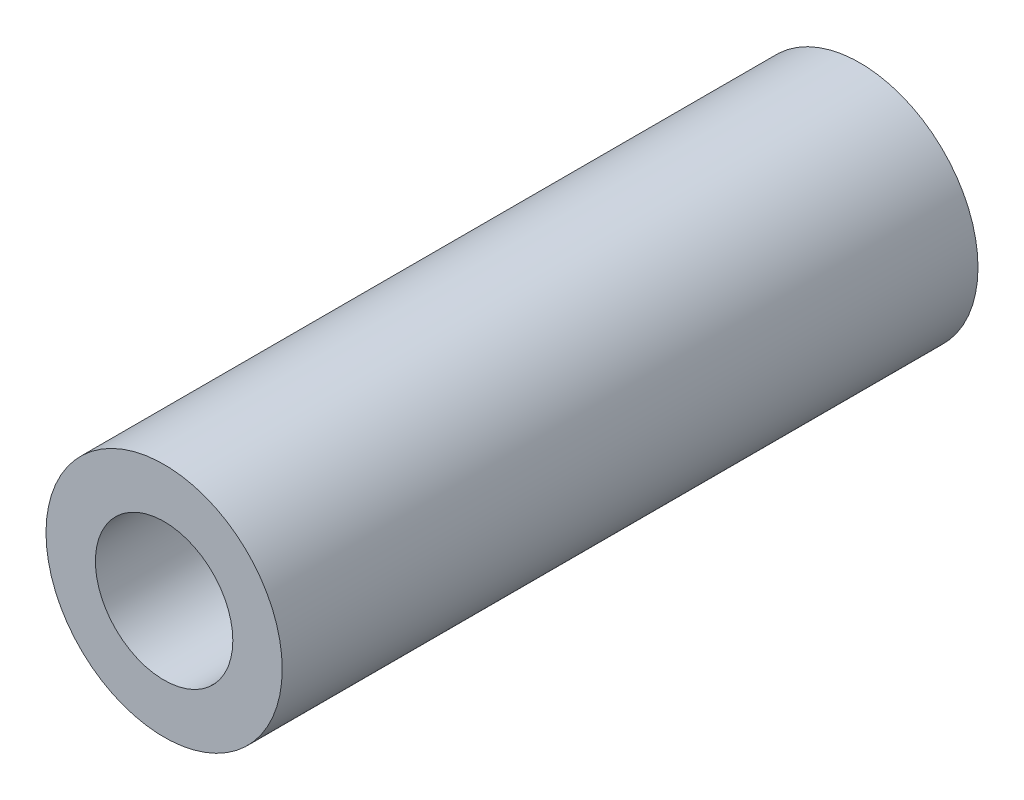
ISO-10303-21;
HEADER;
FILE_DESCRIPTION(('STEP AP214'),'2;1');
FILE_NAME('part.step','',(''),(''),'','','');
FILE_SCHEMA(('AUTOMOTIVE_DESIGN { 1 0 10303 214 1 1 1 1 }'));
ENDSEC;
DATA;
#1=APPLICATION_CONTEXT('core data for automotive mechanical design processes');
#2=APPLICATION_PROTOCOL_DEFINITION('international standard','automotive_design',2000,#1);
#3=PRODUCT_CONTEXT('',#1,'mechanical');
#4=PRODUCT('Part','Part','',(#3));
#5=PRODUCT_RELATED_PRODUCT_CATEGORY('part','',(#4));
#6=PRODUCT_DEFINITION_FORMATION('','',#4);
#7=PRODUCT_DEFINITION_CONTEXT('part definition',#1,'design');
#8=PRODUCT_DEFINITION('design','',#6,#7);
#9=PRODUCT_DEFINITION_SHAPE('','',#8);
#10=(LENGTH_UNIT() NAMED_UNIT(*) SI_UNIT(.MILLI.,.METRE.));
#11=(NAMED_UNIT(*) PLANE_ANGLE_UNIT() SI_UNIT($,.RADIAN.));
#12=(NAMED_UNIT(*) SI_UNIT($,.STERADIAN.) SOLID_ANGLE_UNIT());
#13=UNCERTAINTY_MEASURE_WITH_UNIT(LENGTH_MEASURE(1.E-05),#10,'distance_accuracy_value','');
#14=(GEOMETRIC_REPRESENTATION_CONTEXT(3) GLOBAL_UNCERTAINTY_ASSIGNED_CONTEXT((#13)) GLOBAL_UNIT_ASSIGNED_CONTEXT((#10,
#11,#12)) REPRESENTATION_CONTEXT('',''));
#15=CARTESIAN_POINT('',(0.,0.,0.));
#16=DIRECTION('',(0.,0.,1.));
#17=DIRECTION('',(1.,0.,0.));
#18=AXIS2_PLACEMENT_3D('',#15,#16,#17);
#19=CARTESIAN_POINT('',(0.,0.,16.2));
#20=DIRECTION('',(0.,0.,1.));
#21=DIRECTION('',(1.,0.,0.));
#22=AXIS2_PLACEMENT_3D('',#19,#20,#21);
#23=PLANE('',#22);
#24=CARTESIAN_POINT('',(0.,0.,16.2));
#25=DIRECTION('',(0.,0.,1.));
#26=DIRECTION('',(1.,0.,0.));
#27=AXIS2_PLACEMENT_3D('',#24,#25,#26);
#28=CIRCLE('',#27,2.75);
#29=CARTESIAN_POINT('',(2.75,0.,16.2));
#30=VERTEX_POINT('',#29);
#31=EDGE_CURVE('E10',#30,#30,#28,.T.);
#32=ORIENTED_EDGE('',*,*,#31,.T.);
#33=EDGE_LOOP('',(#32));
#34=FACE_BOUND('',#33,.T.);
#35=CARTESIAN_POINT('',(0.,0.,16.2));
#36=DIRECTION('',(0.,0.,1.));
#37=DIRECTION('',(1.,0.,0.));
#38=AXIS2_PLACEMENT_3D('',#35,#36,#37);
#39=CIRCLE('',#38,1.6);
#40=CARTESIAN_POINT('',(1.6,0.,16.2));
#41=VERTEX_POINT('',#40);
#42=EDGE_CURVE('E48',#41,#41,#39,.T.);
#43=ORIENTED_EDGE('',*,*,#42,.F.);
#44=EDGE_LOOP('',(#43));
#45=FACE_BOUND('',#44,.T.);
#46=ADVANCED_FACE('F37',(#34,#45),#23,.T.);
#47=CARTESIAN_POINT('',(0.,0.,0.));
#48=DIRECTION('',(0.,0.,1.));
#49=DIRECTION('',(1.,0.,0.));
#50=AXIS2_PLACEMENT_3D('',#47,#48,#49);
#51=PLANE('',#50);
#52=CARTESIAN_POINT('',(0.,0.,0.));
#53=DIRECTION('',(0.,0.,1.));
#54=DIRECTION('',(1.,0.,0.));
#55=AXIS2_PLACEMENT_3D('',#52,#53,#54);
#56=CIRCLE('',#55,2.75);
#57=CARTESIAN_POINT('',(2.75,0.,0.));
#58=VERTEX_POINT('',#57);
#59=EDGE_CURVE('E41',#58,#58,#56,.T.);
#60=ORIENTED_EDGE('',*,*,#59,.F.);
#61=EDGE_LOOP('',(#60));
#62=FACE_BOUND('',#61,.T.);
#63=CARTESIAN_POINT('',(0.,0.,0.));
#64=DIRECTION('',(0.,0.,1.));
#65=DIRECTION('',(1.,0.,0.));
#66=AXIS2_PLACEMENT_3D('',#63,#64,#65);
#67=CIRCLE('',#66,1.6);
#68=CARTESIAN_POINT('',(1.6,0.,0.));
#69=VERTEX_POINT('',#68);
#70=EDGE_CURVE('E50',#69,#69,#67,.T.);
#71=ORIENTED_EDGE('',*,*,#70,.T.);
#72=EDGE_LOOP('',(#71));
#73=FACE_BOUND('',#72,.T.);
#74=ADVANCED_FACE('F60',(#62,#73),#51,.F.);
#75=CARTESIAN_POINT('',(0.,0.,16.2));
#76=DIRECTION('',(0.,0.,-1.));
#77=DIRECTION('',(-1.,0.,0.));
#78=AXIS2_PLACEMENT_3D('',#75,#76,#77);
#79=CYLINDRICAL_SURFACE('',#78,2.75);
#80=ORIENTED_EDGE('',*,*,#31,.F.);
#81=EDGE_LOOP('',(#80));
#82=FACE_BOUND('',#81,.T.);
#83=ORIENTED_EDGE('',*,*,#59,.T.);
#84=EDGE_LOOP('',(#83));
#85=FACE_BOUND('',#84,.T.);
#86=ADVANCED_FACE('F39',(#82,#85),#79,.T.);
#87=CARTESIAN_POINT('',(0.,0.,16.2));
#88=DIRECTION('',(0.,0.,-1.));
#89=DIRECTION('',(-1.,0.,0.));
#90=AXIS2_PLACEMENT_3D('',#87,#88,#89);
#91=CYLINDRICAL_SURFACE('',#90,1.6);
#92=ORIENTED_EDGE('',*,*,#42,.T.);
#93=EDGE_LOOP('',(#92));
#94=FACE_BOUND('',#93,.T.);
#95=ORIENTED_EDGE('',*,*,#70,.F.);
#96=EDGE_LOOP('',(#95));
#97=FACE_BOUND('',#96,.T.);
#98=ADVANCED_FACE('F56',(#94,#97),#91,.F.);
#99=CLOSED_SHELL('',(#46,#74,#86,#98));
#100=MANIFOLD_SOLID_BREP('B2',#99);
#101=ADVANCED_BREP_SHAPE_REPRESENTATION('',(#18,#100),#14);
#102=SHAPE_DEFINITION_REPRESENTATION(#9,#101);
ENDSEC;
END-ISO-10303-21;
